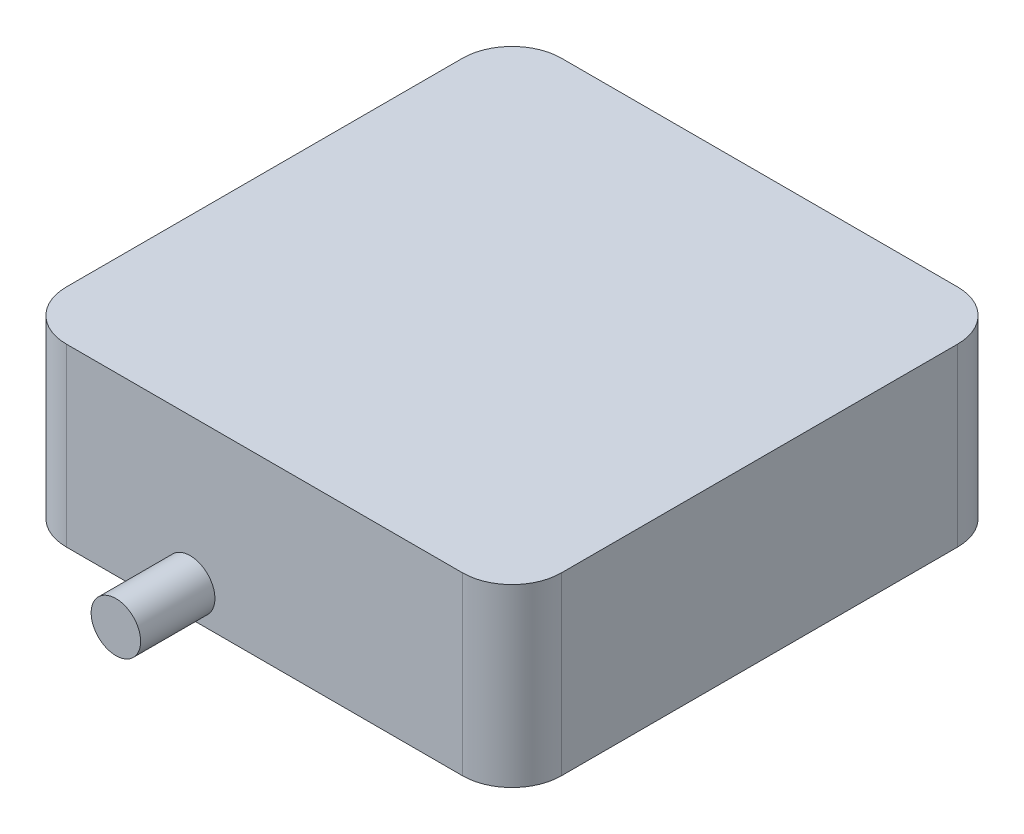
ISO-10303-21;
HEADER;
FILE_DESCRIPTION(('STEP AP214'),'2;1');
FILE_NAME('part.step','',(''),(''),'','','');
FILE_SCHEMA(('AUTOMOTIVE_DESIGN { 1 0 10303 214 1 1 1 1 }'));
ENDSEC;
DATA;
#1=APPLICATION_CONTEXT('core data for automotive mechanical design processes');
#2=APPLICATION_PROTOCOL_DEFINITION('international standard','automotive_design',2000,#1);
#3=PRODUCT_CONTEXT('',#1,'mechanical');
#4=PRODUCT('Part','Part','',(#3));
#5=PRODUCT_RELATED_PRODUCT_CATEGORY('part','',(#4));
#6=PRODUCT_DEFINITION_FORMATION('','',#4);
#7=PRODUCT_DEFINITION_CONTEXT('part definition',#1,'design');
#8=PRODUCT_DEFINITION('design','',#6,#7);
#9=PRODUCT_DEFINITION_SHAPE('','',#8);
#10=(LENGTH_UNIT() NAMED_UNIT(*) SI_UNIT(.MILLI.,.METRE.));
#11=(NAMED_UNIT(*) PLANE_ANGLE_UNIT() SI_UNIT($,.RADIAN.));
#12=(NAMED_UNIT(*) SI_UNIT($,.STERADIAN.) SOLID_ANGLE_UNIT());
#13=UNCERTAINTY_MEASURE_WITH_UNIT(LENGTH_MEASURE(1.E-05),#10,'distance_accuracy_value','');
#14=(GEOMETRIC_REPRESENTATION_CONTEXT(3) GLOBAL_UNCERTAINTY_ASSIGNED_CONTEXT((#13)) GLOBAL_UNIT_ASSIGNED_CONTEXT((#10,
#11,#12)) REPRESENTATION_CONTEXT('',''));
#15=CARTESIAN_POINT('',(0.,0.,0.));
#16=DIRECTION('',(0.,0.,1.));
#17=DIRECTION('',(1.,0.,0.));
#18=AXIS2_PLACEMENT_3D('',#15,#16,#17);
#19=CARTESIAN_POINT('',(100.,71.,100.));
#20=DIRECTION('',(-1.,0.,0.));
#21=DIRECTION('',(0.,0.,1.));
#22=AXIS2_PLACEMENT_3D('',#19,#20,#21);
#23=PLANE('',#22);
#24=DIRECTION('',(0.,0.,-1.));
#25=VECTOR('',#24,1.);
#26=CARTESIAN_POINT('',(100.,0.,100.));
#27=LINE('',#26,#25);
#28=CARTESIAN_POINT('',(100.,0.,80.));
#29=VERTEX_POINT('',#28);
#30=CARTESIAN_POINT('',(100.,0.,-80.));
#31=VERTEX_POINT('',#30);
#32=EDGE_CURVE('E147',#29,#31,#27,.T.);
#33=ORIENTED_EDGE('',*,*,#32,.T.);
#34=DIRECTION('',(0.,-1.,0.));
#35=VECTOR('',#34,1.);
#36=CARTESIAN_POINT('',(100.,71.,-80.));
#37=LINE('',#36,#35);
#38=CARTESIAN_POINT('',(100.,71.,-80.));
#39=VERTEX_POINT('',#38);
#40=EDGE_CURVE('E181',#31,#39,#37,.F.);
#41=ORIENTED_EDGE('',*,*,#40,.T.);
#42=DIRECTION('',(0.,0.,-1.));
#43=VECTOR('',#42,1.);
#44=CARTESIAN_POINT('',(100.,71.,100.));
#45=LINE('',#44,#43);
#46=CARTESIAN_POINT('',(100.,71.,80.));
#47=VERTEX_POINT('',#46);
#48=EDGE_CURVE('E145',#47,#39,#45,.T.);
#49=ORIENTED_EDGE('',*,*,#48,.F.);
#50=DIRECTION('',(0.,-1.,0.));
#51=VECTOR('',#50,1.);
#52=CARTESIAN_POINT('',(100.,71.,80.));
#53=LINE('',#52,#51);
#54=EDGE_CURVE('E177',#47,#29,#53,.T.);
#55=ORIENTED_EDGE('',*,*,#54,.T.);
#56=EDGE_LOOP('',(#33,#41,#49,#55));
#57=FACE_BOUND('',#56,.T.);
#58=ADVANCED_FACE('F45',(#57),#23,.F.);
#59=CARTESIAN_POINT('',(-100.,71.,-100.));
#60=DIRECTION('',(0.,0.,1.));
#61=DIRECTION('',(1.,0.,0.));
#62=AXIS2_PLACEMENT_3D('',#59,#60,#61);
#63=PLANE('',#62);
#64=DIRECTION('',(-1.,0.,0.));
#65=VECTOR('',#64,1.);
#66=CARTESIAN_POINT('',(-100.,0.,-100.));
#67=LINE('',#66,#65);
#68=CARTESIAN_POINT('',(80.,0.,-100.));
#69=VERTEX_POINT('',#68);
#70=CARTESIAN_POINT('',(-80.,0.,-100.));
#71=VERTEX_POINT('',#70);
#72=EDGE_CURVE('E141',#69,#71,#67,.T.);
#73=ORIENTED_EDGE('',*,*,#72,.T.);
#74=DIRECTION('',(0.,-1.,0.));
#75=VECTOR('',#74,1.);
#76=CARTESIAN_POINT('',(-80.,71.,-100.));
#77=LINE('',#76,#75);
#78=CARTESIAN_POINT('',(-80.,71.,-100.));
#79=VERTEX_POINT('',#78);
#80=EDGE_CURVE('E117',#71,#79,#77,.F.);
#81=ORIENTED_EDGE('',*,*,#80,.T.);
#82=DIRECTION('',(-1.,0.,0.));
#83=VECTOR('',#82,1.);
#84=CARTESIAN_POINT('',(-100.,71.,-100.));
#85=LINE('',#84,#83);
#86=CARTESIAN_POINT('',(80.,71.,-100.));
#87=VERTEX_POINT('',#86);
#88=EDGE_CURVE('E192',#87,#79,#85,.T.);
#89=ORIENTED_EDGE('',*,*,#88,.F.);
#90=DIRECTION('',(0.,-1.,0.));
#91=VECTOR('',#90,1.);
#92=CARTESIAN_POINT('',(80.,71.,-100.));
#93=LINE('',#92,#91);
#94=EDGE_CURVE('E123',#87,#69,#93,.T.);
#95=ORIENTED_EDGE('',*,*,#94,.T.);
#96=EDGE_LOOP('',(#73,#81,#89,#95));
#97=FACE_BOUND('',#96,.T.);
#98=ADVANCED_FACE('F234',(#97),#63,.F.);
#99=CARTESIAN_POINT('',(-100.,71.,100.));
#100=DIRECTION('',(1.,0.,0.));
#101=DIRECTION('',(0.,0.,-1.));
#102=AXIS2_PLACEMENT_3D('',#99,#100,#101);
#103=PLANE('',#102);
#104=DIRECTION('',(0.,0.,1.));
#105=VECTOR('',#104,1.);
#106=CARTESIAN_POINT('',(-100.,71.,100.));
#107=LINE('',#106,#105);
#108=CARTESIAN_POINT('',(-100.,71.,-80.));
#109=VERTEX_POINT('',#108);
#110=CARTESIAN_POINT('',(-100.,71.,80.));
#111=VERTEX_POINT('',#110);
#112=EDGE_CURVE('E132',#109,#111,#107,.T.);
#113=ORIENTED_EDGE('',*,*,#112,.F.);
#114=DIRECTION('',(0.,-1.,0.));
#115=VECTOR('',#114,1.);
#116=CARTESIAN_POINT('',(-100.,71.,-80.));
#117=LINE('',#116,#115);
#118=CARTESIAN_POINT('',(-100.,0.,-80.));
#119=VERTEX_POINT('',#118);
#120=EDGE_CURVE('E116',#109,#119,#117,.T.);
#121=ORIENTED_EDGE('',*,*,#120,.T.);
#122=DIRECTION('',(0.,0.,1.));
#123=VECTOR('',#122,1.);
#124=CARTESIAN_POINT('',(-100.,0.,100.));
#125=LINE('',#124,#123);
#126=CARTESIAN_POINT('',(-100.,0.,80.));
#127=VERTEX_POINT('',#126);
#128=EDGE_CURVE('E130',#119,#127,#125,.T.);
#129=ORIENTED_EDGE('',*,*,#128,.T.);
#130=DIRECTION('',(0.,-1.,0.));
#131=VECTOR('',#130,1.);
#132=CARTESIAN_POINT('',(-100.,71.,80.));
#133=LINE('',#132,#131);
#134=EDGE_CURVE('E135',#127,#111,#133,.F.);
#135=ORIENTED_EDGE('',*,*,#134,.T.);
#136=EDGE_LOOP('',(#113,#121,#129,#135));
#137=FACE_BOUND('',#136,.T.);
#138=ADVANCED_FACE('F129',(#137),#103,.F.);
#139=CARTESIAN_POINT('',(-100.,71.,100.));
#140=DIRECTION('',(0.,0.,-1.));
#141=DIRECTION('',(-1.,0.,0.));
#142=AXIS2_PLACEMENT_3D('',#139,#140,#141);
#143=PLANE('',#142);
#144=CARTESIAN_POINT('',(-30.,12.,100.));
#145=DIRECTION('',(0.,0.,-1.));
#146=DIRECTION('',(-1.,0.,0.));
#147=AXIS2_PLACEMENT_3D('',#144,#145,#146);
#148=CIRCLE('',#147,10.);
#149=CARTESIAN_POINT('',(-40.,12.,100.));
#150=VERTEX_POINT('',#149);
#151=EDGE_CURVE('E11',#150,#150,#148,.F.);
#152=ORIENTED_EDGE('',*,*,#151,.F.);
#153=EDGE_LOOP('',(#152));
#154=FACE_BOUND('',#153,.T.);
#155=DIRECTION('',(1.,0.,0.));
#156=VECTOR('',#155,1.);
#157=CARTESIAN_POINT('',(-100.,0.,100.));
#158=LINE('',#157,#156);
#159=CARTESIAN_POINT('',(-80.,0.,100.));
#160=VERTEX_POINT('',#159);
#161=CARTESIAN_POINT('',(80.,0.,100.));
#162=VERTEX_POINT('',#161);
#163=EDGE_CURVE('E140',#160,#162,#158,.T.);
#164=ORIENTED_EDGE('',*,*,#163,.T.);
#165=DIRECTION('',(0.,-1.,0.));
#166=VECTOR('',#165,1.);
#167=CARTESIAN_POINT('',(80.,71.,100.));
#168=LINE('',#167,#166);
#169=CARTESIAN_POINT('',(80.,71.,100.));
#170=VERTEX_POINT('',#169);
#171=EDGE_CURVE('E54',#162,#170,#168,.F.);
#172=ORIENTED_EDGE('',*,*,#171,.T.);
#173=DIRECTION('',(1.,0.,0.));
#174=VECTOR('',#173,1.);
#175=CARTESIAN_POINT('',(-100.,71.,100.));
#176=LINE('',#175,#174);
#177=CARTESIAN_POINT('',(-80.,71.,100.));
#178=VERTEX_POINT('',#177);
#179=EDGE_CURVE('E152',#178,#170,#176,.T.);
#180=ORIENTED_EDGE('',*,*,#179,.F.);
#181=DIRECTION('',(0.,-1.,0.));
#182=VECTOR('',#181,1.);
#183=CARTESIAN_POINT('',(-80.,71.,100.));
#184=LINE('',#183,#182);
#185=EDGE_CURVE('E184',#178,#160,#184,.T.);
#186=ORIENTED_EDGE('',*,*,#185,.T.);
#187=EDGE_LOOP('',(#164,#172,#180,#186));
#188=FACE_BOUND('',#187,.T.);
#189=ADVANCED_FACE('F220',(#154,#188),#143,.F.);
#190=CARTESIAN_POINT('',(0.,71.,0.));
#191=DIRECTION('',(0.,-1.,0.));
#192=DIRECTION('',(0.,0.,-1.));
#193=AXIS2_PLACEMENT_3D('',#190,#191,#192);
#194=PLANE('',#193);
#195=ORIENTED_EDGE('',*,*,#88,.T.);
#196=CARTESIAN_POINT('',(-80.,71.,-80.));
#197=DIRECTION('',(0.,-1.,0.));
#198=DIRECTION('',(0.,0.,-1.));
#199=AXIS2_PLACEMENT_3D('',#196,#197,#198);
#200=CIRCLE('',#199,20.);
#201=EDGE_CURVE('E174',#79,#109,#200,.F.);
#202=ORIENTED_EDGE('',*,*,#201,.T.);
#203=ORIENTED_EDGE('',*,*,#112,.T.);
#204=CARTESIAN_POINT('',(-80.,71.,80.));
#205=DIRECTION('',(0.,-1.,0.));
#206=DIRECTION('',(0.,0.,-1.));
#207=AXIS2_PLACEMENT_3D('',#204,#205,#206);
#208=CIRCLE('',#207,20.);
#209=EDGE_CURVE('E67',#111,#178,#208,.F.);
#210=ORIENTED_EDGE('',*,*,#209,.T.);
#211=ORIENTED_EDGE('',*,*,#179,.T.);
#212=CARTESIAN_POINT('',(80.,71.,80.));
#213=DIRECTION('',(0.,-1.,0.));
#214=DIRECTION('',(0.,0.,-1.));
#215=AXIS2_PLACEMENT_3D('',#212,#213,#214);
#216=CIRCLE('',#215,20.);
#217=EDGE_CURVE('E168',#170,#47,#216,.F.);
#218=ORIENTED_EDGE('',*,*,#217,.T.);
#219=ORIENTED_EDGE('',*,*,#48,.T.);
#220=CARTESIAN_POINT('',(80.,71.,-80.));
#221=DIRECTION('',(0.,-1.,0.));
#222=DIRECTION('',(0.,0.,-1.));
#223=AXIS2_PLACEMENT_3D('',#220,#221,#222);
#224=CIRCLE('',#223,20.);
#225=EDGE_CURVE('E171',#39,#87,#224,.F.);
#226=ORIENTED_EDGE('',*,*,#225,.T.);
#227=EDGE_LOOP('',(#195,#202,#203,#210,#211,#218,#219,#226));
#228=FACE_BOUND('',#227,.T.);
#229=ADVANCED_FACE('F222',(#228),#194,.F.);
#230=CARTESIAN_POINT('',(0.,0.,0.));
#231=DIRECTION('',(0.,-1.,0.));
#232=DIRECTION('',(0.,0.,-1.));
#233=AXIS2_PLACEMENT_3D('',#230,#231,#232);
#234=PLANE('',#233);
#235=ORIENTED_EDGE('',*,*,#128,.F.);
#236=CARTESIAN_POINT('',(-80.,0.,-80.));
#237=DIRECTION('',(0.,-1.,0.));
#238=DIRECTION('',(0.,0.,-1.));
#239=AXIS2_PLACEMENT_3D('',#236,#237,#238);
#240=CIRCLE('',#239,20.);
#241=EDGE_CURVE('E112',#119,#71,#240,.T.);
#242=ORIENTED_EDGE('',*,*,#241,.T.);
#243=ORIENTED_EDGE('',*,*,#72,.F.);
#244=CARTESIAN_POINT('',(80.,0.,-80.));
#245=DIRECTION('',(0.,-1.,0.));
#246=DIRECTION('',(0.,0.,-1.));
#247=AXIS2_PLACEMENT_3D('',#244,#245,#246);
#248=CIRCLE('',#247,20.);
#249=EDGE_CURVE('E124',#69,#31,#248,.T.);
#250=ORIENTED_EDGE('',*,*,#249,.T.);
#251=ORIENTED_EDGE('',*,*,#32,.F.);
#252=CARTESIAN_POINT('',(80.,0.,80.));
#253=DIRECTION('',(0.,-1.,0.));
#254=DIRECTION('',(0.,0.,-1.));
#255=AXIS2_PLACEMENT_3D('',#252,#253,#254);
#256=CIRCLE('',#255,20.);
#257=EDGE_CURVE('E156',#29,#162,#256,.T.);
#258=ORIENTED_EDGE('',*,*,#257,.T.);
#259=ORIENTED_EDGE('',*,*,#163,.F.);
#260=CARTESIAN_POINT('',(-80.,0.,80.));
#261=DIRECTION('',(0.,-1.,0.));
#262=DIRECTION('',(0.,0.,-1.));
#263=AXIS2_PLACEMENT_3D('',#260,#261,#262);
#264=CIRCLE('',#263,20.);
#265=EDGE_CURVE('E134',#160,#127,#264,.T.);
#266=ORIENTED_EDGE('',*,*,#265,.T.);
#267=EDGE_LOOP('',(#235,#242,#243,#250,#251,#258,#259,#266));
#268=FACE_BOUND('',#267,.T.);
#269=ADVANCED_FACE('F137',(#268),#234,.T.);
#270=CARTESIAN_POINT('',(-80.,71.,-80.));
#271=DIRECTION('',(0.,-1.,0.));
#272=DIRECTION('',(0.,0.,-1.));
#273=AXIS2_PLACEMENT_3D('',#270,#271,#272);
#274=CYLINDRICAL_SURFACE('',#273,20.);
#275=ORIENTED_EDGE('',*,*,#201,.F.);
#276=ORIENTED_EDGE('',*,*,#80,.F.);
#277=ORIENTED_EDGE('',*,*,#241,.F.);
#278=ORIENTED_EDGE('',*,*,#120,.F.);
#279=EDGE_LOOP('',(#275,#276,#277,#278));
#280=FACE_BOUND('',#279,.T.);
#281=ADVANCED_FACE('F115',(#280),#274,.T.);
#282=CARTESIAN_POINT('',(80.,71.,-80.));
#283=DIRECTION('',(0.,-1.,0.));
#284=DIRECTION('',(0.,0.,-1.));
#285=AXIS2_PLACEMENT_3D('',#282,#283,#284);
#286=CYLINDRICAL_SURFACE('',#285,20.);
#287=ORIENTED_EDGE('',*,*,#225,.F.);
#288=ORIENTED_EDGE('',*,*,#40,.F.);
#289=ORIENTED_EDGE('',*,*,#249,.F.);
#290=ORIENTED_EDGE('',*,*,#94,.F.);
#291=EDGE_LOOP('',(#287,#288,#289,#290));
#292=FACE_BOUND('',#291,.T.);
#293=ADVANCED_FACE('F230',(#292),#286,.T.);
#294=CARTESIAN_POINT('',(80.,71.,80.));
#295=DIRECTION('',(0.,-1.,0.));
#296=DIRECTION('',(0.,0.,-1.));
#297=AXIS2_PLACEMENT_3D('',#294,#295,#296);
#298=CYLINDRICAL_SURFACE('',#297,20.);
#299=ORIENTED_EDGE('',*,*,#217,.F.);
#300=ORIENTED_EDGE('',*,*,#171,.F.);
#301=ORIENTED_EDGE('',*,*,#257,.F.);
#302=ORIENTED_EDGE('',*,*,#54,.F.);
#303=EDGE_LOOP('',(#299,#300,#301,#302));
#304=FACE_BOUND('',#303,.T.);
#305=ADVANCED_FACE('F227',(#304),#298,.T.);
#306=CARTESIAN_POINT('',(-80.,71.,80.));
#307=DIRECTION('',(0.,-1.,0.));
#308=DIRECTION('',(0.,0.,-1.));
#309=AXIS2_PLACEMENT_3D('',#306,#307,#308);
#310=CYLINDRICAL_SURFACE('',#309,20.);
#311=ORIENTED_EDGE('',*,*,#209,.F.);
#312=ORIENTED_EDGE('',*,*,#134,.F.);
#313=ORIENTED_EDGE('',*,*,#265,.F.);
#314=ORIENTED_EDGE('',*,*,#185,.F.);
#315=EDGE_LOOP('',(#311,#312,#313,#314));
#316=FACE_BOUND('',#315,.T.);
#317=ADVANCED_FACE('F47',(#316),#310,.T.);
#318=CARTESIAN_POINT('',(-30.,12.,130.));
#319=DIRECTION('',(0.,0.,-1.));
#320=DIRECTION('',(-1.,0.,0.));
#321=AXIS2_PLACEMENT_3D('',#318,#319,#320);
#322=CYLINDRICAL_SURFACE('',#321,10.);
#323=CARTESIAN_POINT('',(-30.,12.,130.));
#324=DIRECTION('',(0.,0.,1.));
#325=DIRECTION('',(1.,0.,0.));
#326=AXIS2_PLACEMENT_3D('',#323,#324,#325);
#327=CIRCLE('',#326,10.);
#328=CARTESIAN_POINT('',(-20.,12.,130.));
#329=VERTEX_POINT('',#328);
#330=EDGE_CURVE('E202',#329,#329,#327,.T.);
#331=ORIENTED_EDGE('',*,*,#330,.F.);
#332=EDGE_LOOP('',(#331));
#333=FACE_BOUND('',#332,.T.);
#334=ORIENTED_EDGE('',*,*,#151,.T.);
#335=EDGE_LOOP('',(#334));
#336=FACE_BOUND('',#335,.T.);
#337=ADVANCED_FACE('F214',(#333,#336),#322,.T.);
#338=CARTESIAN_POINT('',(-30.,12.,130.));
#339=DIRECTION('',(0.,0.,1.));
#340=DIRECTION('',(1.,0.,0.));
#341=AXIS2_PLACEMENT_3D('',#338,#339,#340);
#342=PLANE('',#341);
#343=ORIENTED_EDGE('',*,*,#330,.T.);
#344=EDGE_LOOP('',(#343));
#345=FACE_BOUND('',#344,.T.);
#346=ADVANCED_FACE('F212',(#345),#342,.T.);
#347=CLOSED_SHELL('',(#58,#98,#138,#189,#229,#269,#281,#293,#305,#317,#337,#346));
#348=MANIFOLD_SOLID_BREP('B2',#347);
#349=ADVANCED_BREP_SHAPE_REPRESENTATION('',(#18,#348),#14);
#350=SHAPE_DEFINITION_REPRESENTATION(#9,#349);
ENDSEC;
END-ISO-10303-21;
